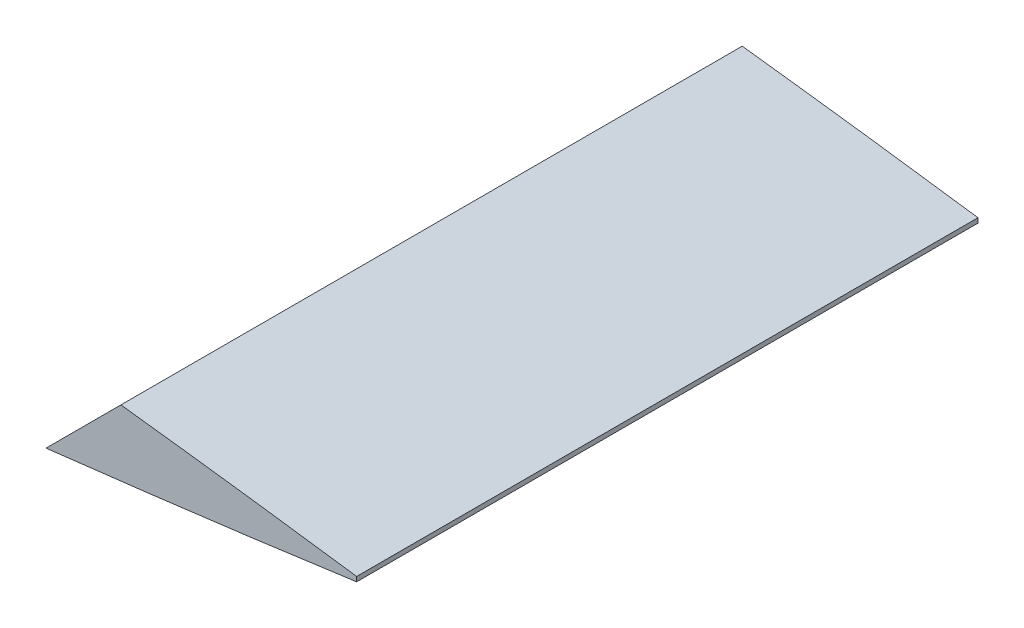
ISO-10303-21;
HEADER;
FILE_DESCRIPTION(('STEP AP214'),'2;1');
FILE_NAME('part.step','',(''),(''),'','','');
FILE_SCHEMA(('AUTOMOTIVE_DESIGN { 1 0 10303 214 1 1 1 1 }'));
ENDSEC;
DATA;
#1=APPLICATION_CONTEXT('core data for automotive mechanical design processes');
#2=APPLICATION_PROTOCOL_DEFINITION('international standard','automotive_design',2000,#1);
#3=PRODUCT_CONTEXT('',#1,'mechanical');
#4=PRODUCT('Part','Part','',(#3));
#5=PRODUCT_RELATED_PRODUCT_CATEGORY('part','',(#4));
#6=PRODUCT_DEFINITION_FORMATION('','',#4);
#7=PRODUCT_DEFINITION_CONTEXT('part definition',#1,'design');
#8=PRODUCT_DEFINITION('design','',#6,#7);
#9=PRODUCT_DEFINITION_SHAPE('','',#8);
#10=(LENGTH_UNIT() NAMED_UNIT(*) SI_UNIT(.MILLI.,.METRE.));
#11=(NAMED_UNIT(*) PLANE_ANGLE_UNIT() SI_UNIT($,.RADIAN.));
#12=(NAMED_UNIT(*) SI_UNIT($,.STERADIAN.) SOLID_ANGLE_UNIT());
#13=UNCERTAINTY_MEASURE_WITH_UNIT(LENGTH_MEASURE(1.E-05),#10,'distance_accuracy_value','');
#14=(GEOMETRIC_REPRESENTATION_CONTEXT(3) GLOBAL_UNCERTAINTY_ASSIGNED_CONTEXT((#13)) GLOBAL_UNIT_ASSIGNED_CONTEXT((#10,
#11,#12)) REPRESENTATION_CONTEXT('',''));
#15=CARTESIAN_POINT('',(0.,0.,0.));
#16=DIRECTION('',(0.,0.,1.));
#17=DIRECTION('',(1.,0.,0.));
#18=AXIS2_PLACEMENT_3D('',#15,#16,#17);
#19=CARTESIAN_POINT('',(300.,0.378,100.));
#20=CARTESIAN_POINT('',(299.270406423723,0.479445821702321,100.));
#21=CARTESIAN_POINT('',(297.234667094079,0.762503753929655,100.));
#22=CARTESIAN_POINT('',(293.659650160598,1.25767350567564,100.));
#23=CARTESIAN_POINT('',(289.112411794917,1.87424244263317,100.));
#24=CARTESIAN_POINT('',(284.080816659039,2.54451744035542,100.));
#25=CARTESIAN_POINT('',(278.752044218457,3.23812231587756,100.));
#26=CARTESIAN_POINT('',(273.265899022492,3.93494643569603,100.));
#27=CARTESIAN_POINT('',(267.705955472008,4.62901994283452,100.));
#28=CARTESIAN_POINT('',(262.114563019878,5.31306910693868,100.));
#29=CARTESIAN_POINT('',(256.508348909458,5.98219181245687,100.));
#30=CARTESIAN_POINT('',(250.891738994323,6.63799080906206,100.));
#31=CARTESIAN_POINT('',(245.269556965141,7.28177923500822,100.));
#32=CARTESIAN_POINT('',(239.647345348642,7.91223276352409,100.));
#33=CARTESIAN_POINT('',(234.025130106878,8.52699204615673,100.));
#34=CARTESIAN_POINT('',(228.399087902931,9.12622976388424,100.));
#35=CARTESIAN_POINT('',(222.76825764507,9.71307760610579,100.));
#36=CARTESIAN_POINT('',(217.135920793231,10.2874598097057,100.));
#37=CARTESIAN_POINT('',(211.505410154051,10.8469410839575,100.));
#38=CARTESIAN_POINT('',(205.877619803237,11.3916428267252,100.));
#39=CARTESIAN_POINT('',(200.251512373849,11.9208846239163,100.));
#40=CARTESIAN_POINT('',(194.626420536409,12.4346170780367,100.));
#41=CARTESIAN_POINT('',(189.002797137157,12.9319118094686,100.));
#42=CARTESIAN_POINT('',(183.381530937822,13.4130975813696,100.));
#43=CARTESIAN_POINT('',(177.763225616091,13.8763767009773,100.));
#44=CARTESIAN_POINT('',(172.148301533052,14.3212371935345,100.));
#45=CARTESIAN_POINT('',(166.537529461529,14.7478209184035,100.));
#46=CARTESIAN_POINT('',(160.931736194082,15.1542281440202,100.));
#47=CARTESIAN_POINT('',(155.331708850266,15.5391008558727,100.));
#48=CARTESIAN_POINT('',(149.737538344952,15.9026495636587,100.));
#49=CARTESIAN_POINT('',(144.148688279318,16.241846118568,100.));
#50=CARTESIAN_POINT('',(138.565679604284,16.5574205464223,100.));
#51=CARTESIAN_POINT('',(132.990859803018,16.8473975552547,100.));
#52=CARTESIAN_POINT('',(127.427439440236,17.1102116785312,100.));
#53=CARTESIAN_POINT('',(121.877619637439,17.3438917175145,100.));
#54=CARTESIAN_POINT('',(116.340758577333,17.5452568128182,100.));
#55=CARTESIAN_POINT('',(110.815476382379,17.712679119923,100.));
#56=CARTESIAN_POINT('',(105.301273398415,17.8444979379819,100.));
#57=CARTESIAN_POINT('',(99.8005701155126,17.9400918128776,100.));
#58=CARTESIAN_POINT('',(94.3174358437247,17.9965904385618,100.));
#59=CARTESIAN_POINT('',(88.8557640671298,18.0101244579531,100.));
#60=CARTESIAN_POINT('',(83.4186479748791,17.9792338403315,100.));
#61=CARTESIAN_POINT('',(78.0084808270908,17.8991607130085,100.));
#62=CARTESIAN_POINT('',(72.6284553647751,17.7670337872511,100.));
#63=CARTESIAN_POINT('',(67.2827387457577,17.5794139337101,100.));
#64=CARTESIAN_POINT('',(61.9773648945375,17.331515488689,100.));
#65=CARTESIAN_POINT('',(56.7206910156783,17.0210326511062,100.));
#66=CARTESIAN_POINT('',(51.5251753215055,16.6409580698619,100.));
#67=CARTESIAN_POINT('',(46.4082026187076,16.1901885907441,100.));
#68=CARTESIAN_POINT('',(41.3941760651905,15.6616690993154,100.));
#69=CARTESIAN_POINT('',(36.5156710865437,15.0539637839737,100.));
#70=CARTESIAN_POINT('',(31.8190094409283,14.3656236049764,100.));
#71=CARTESIAN_POINT('',(27.3661648285309,13.6034756838757,100.));
#72=CARTESIAN_POINT('',(23.2352179540624,12.7825834438859,100.));
#73=CARTESIAN_POINT('',(19.5026424507863,11.9202507512816,100.));
#74=CARTESIAN_POINT('',(16.2182713927649,11.0445977962822,100.));
#75=CARTESIAN_POINT('',(13.3891860155784,10.1750762553965,100.));
#76=CARTESIAN_POINT('',(10.9849293334544,9.33349871540906,100.));
#77=CARTESIAN_POINT('',(8.96156147750924,8.52206288153796,100.));
#78=CARTESIAN_POINT('',(7.26729205281864,7.74697600174495,100.));
#79=CARTESIAN_POINT('',(5.84605246563954,7.01062562176008,100.));
#80=CARTESIAN_POINT('',(4.64771108498271,6.30063403293287,100.));
#81=CARTESIAN_POINT('',(3.62823525123192,5.60651366797511,100.));
#82=CARTESIAN_POINT('',(2.75190919699738,4.92663525162572,100.));
#83=CARTESIAN_POINT('',(2.0062573601689,4.24991725904032,100.));
#84=CARTESIAN_POINT('',(1.39058613668709,3.570259491991,100.));
#85=CARTESIAN_POINT('',(0.901000434809516,2.89094225228363,100.));
#86=CARTESIAN_POINT('',(0.529275534924718,2.22021927340558,100.));
#87=CARTESIAN_POINT('',(0.260479536936117,1.56645893590234,100.));
#88=CARTESIAN_POINT('',(0.0857126538537306,0.931035928118987,100.));
#89=CARTESIAN_POINT('',(-0.00350924718492415,0.308981014512189,100.));
#90=CARTESIAN_POINT('',(-0.00350924718492199,-0.308981014512209,100.));
#91=CARTESIAN_POINT('',(0.0857126538537279,-0.931035928118965,100.));
#92=CARTESIAN_POINT('',(0.260479536936107,-1.56645893590232,100.));
#93=CARTESIAN_POINT('',(0.529275534924743,-2.2202192734056,100.));
#94=CARTESIAN_POINT('',(0.901000434809474,-2.89094225228368,100.));
#95=CARTESIAN_POINT('',(1.39058613668717,-3.57025949199063,100.));
#96=CARTESIAN_POINT('',(2.00625736016862,-4.24991725904197,100.));
#97=CARTESIAN_POINT('',(2.75190919699857,-4.92663525161857,100.));
#98=CARTESIAN_POINT('',(3.62823525122678,-5.60651366800603,100.));
#99=CARTESIAN_POINT('',(4.6477110850053,-6.3006340327972,100.));
#100=CARTESIAN_POINT('',(5.84605246553727,-7.01062562237321,100.));
#101=CARTESIAN_POINT('',(7.26729205329404,-7.74697599889616,100.));
#102=CARTESIAN_POINT('',(8.96156147525896,-8.5220628950217,100.));
#103=CARTESIAN_POINT('',(10.9849293441544,-9.33349865129378,100.));
#104=CARTESIAN_POINT('',(13.3891859649807,-10.1750765585832,100.));
#105=CARTESIAN_POINT('',(16.218271629693,-11.0445963765829,100.));
#106=CARTESIAN_POINT('',(19.5026413612413,-11.9202572799561,100.));
#107=CARTESIAN_POINT('',(23.2352227989104,-12.78255441302,100.));
#108=CARTESIAN_POINT('',(27.3661275586072,-13.6035961608478,100.));
#109=CARTESIAN_POINT('',(31.8190750083372,-14.3651133634918,100.));
#110=CARTESIAN_POINT('',(36.5156346373272,-15.0541060972868,100.));
#111=CARTESIAN_POINT('',(41.3941822041013,-15.6616288870965,100.));
#112=CARTESIAN_POINT('',(46.4082009236496,-16.1901996940233,100.));
#113=CARTESIAN_POINT('',(51.5251757859908,-16.6409550273053,100.));
#114=CARTESIAN_POINT('',(56.7206908890808,-17.0210334803687,100.));
#115=CARTESIAN_POINT('',(61.9773649289189,-17.3315152634777,100.));
#116=CARTESIAN_POINT('',(67.2827387364428,-17.5794139947263,100.));
#117=CARTESIAN_POINT('',(72.6284553672946,-17.767033770747,100.));
#118=CARTESIAN_POINT('',(78.0084808264101,-17.8991607174675,100.));
#119=CARTESIAN_POINT('',(83.4186479750628,-17.9792338391277,100.));
#120=CARTESIAN_POINT('',(88.8557640670803,-18.0101244582778,100.));
#121=CARTESIAN_POINT('',(94.317435843738,-17.9965904384742,100.));
#122=CARTESIAN_POINT('',(99.8005701155091,-17.9400918129012,100.));
#123=CARTESIAN_POINT('',(105.301273398416,-17.8444979379756,100.));
#124=CARTESIAN_POINT('',(110.815476382379,-17.7126791199247,100.));
#125=CARTESIAN_POINT('',(116.340758577333,-17.5452568128177,100.));
#126=CARTESIAN_POINT('',(121.877619637439,-17.3438917175146,100.));
#127=CARTESIAN_POINT('',(127.427439440236,-17.1102116785312,100.));
#128=CARTESIAN_POINT('',(132.990859803018,-16.8473975552547,100.));
#129=CARTESIAN_POINT('',(138.565679604284,-16.5574205464223,100.));
#130=CARTESIAN_POINT('',(144.148688279318,-16.241846118568,100.));
#131=CARTESIAN_POINT('',(149.737538344952,-15.9026495636587,100.));
#132=CARTESIAN_POINT('',(155.331708850266,-15.5391008558727,100.));
#133=CARTESIAN_POINT('',(160.931736194082,-15.1542281440202,100.));
#134=CARTESIAN_POINT('',(166.537529461529,-14.7478209184035,100.));
#135=CARTESIAN_POINT('',(172.148301533052,-14.3212371935345,100.));
#136=CARTESIAN_POINT('',(177.763225616091,-13.8763767009773,100.));
#137=CARTESIAN_POINT('',(183.381530937822,-13.4130975813696,100.));
#138=CARTESIAN_POINT('',(189.002797137156,-12.9319118094686,100.));
#139=CARTESIAN_POINT('',(194.626420536409,-12.4346170780367,100.));
#140=CARTESIAN_POINT('',(200.251512373849,-11.9208846239163,100.));
#141=CARTESIAN_POINT('',(205.877619803237,-11.3916428267251,100.));
#142=CARTESIAN_POINT('',(211.505410154051,-10.8469410839575,100.));
#143=CARTESIAN_POINT('',(217.135920793231,-10.2874598097057,100.));
#144=CARTESIAN_POINT('',(222.76825764507,-9.71307760610578,100.));
#145=CARTESIAN_POINT('',(228.399087902931,-9.12622976388424,100.));
#146=CARTESIAN_POINT('',(234.025130106878,-8.52699204615673,100.));
#147=CARTESIAN_POINT('',(239.647345348642,-7.91223276352409,100.));
#148=CARTESIAN_POINT('',(245.269556965141,-7.28177923500822,100.));
#149=CARTESIAN_POINT('',(250.891738994323,-6.63799080906206,100.));
#150=CARTESIAN_POINT('',(256.508348909458,-5.98219181245686,100.));
#151=CARTESIAN_POINT('',(262.114563019878,-5.31306910693868,100.));
#152=CARTESIAN_POINT('',(267.705955472008,-4.62901994283452,100.));
#153=CARTESIAN_POINT('',(273.265899022492,-3.93494643569603,100.));
#154=CARTESIAN_POINT('',(278.752044218457,-3.23812231587756,100.));
#155=CARTESIAN_POINT('',(284.080816659039,-2.54451744035542,100.));
#156=CARTESIAN_POINT('',(289.112411794917,-1.87424244263317,100.));
#157=CARTESIAN_POINT('',(293.659650160598,-1.25767350567564,100.));
#158=CARTESIAN_POINT('',(297.234667094079,-0.76250375392966,100.));
#159=CARTESIAN_POINT('',(299.270406423723,-0.479445821702321,100.));
#160=CARTESIAN_POINT('',(300.,-0.378,100.));
#161=B_SPLINE_CURVE_WITH_KNOTS('',3,(#19,#20,#21,#22,#23,#24,#25,#26,#27,#28,#29,#30,#31,#32,
#33,#34,#35,#36,#37,#38,#39,#40,#41,#42,#43,#44,#45,#46,#47,#48,#49,#50,#51,#52,#53,#54,#55,#56,
#57,#58,#59,#60,#61,#62,#63,#64,#65,#66,#67,#68,#69,#70,#71,#72,#73,#74,#75,#76,#77,#78,#79,#80,
#81,#82,#83,#84,#85,#86,#87,#88,#89,#90,#91,#92,#93,#94,#95,#96,#97,#98,#99,#100,#101,#102,#103,
#104,#105,#106,#107,#108,#109,#110,#111,#112,#113,#114,#115,#116,#117,#118,#119,#120,#121,#122,
#123,#124,#125,#126,#127,#128,#129,#130,#131,#132,#133,#134,#135,#136,#137,#138,#139,#140,#141,
#142,#143,#144,#145,#146,#147,#148,#149,#150,#151,#152,#153,#154,#155,#156,#157,#158,#159,#160),
.UNSPECIFIED.,.F.,.F.,(4,1,1,1,1,1,1,1,1,1,1,1,1,1,1,1,1,1,1,1,1,1,1,1,1,1,1,1,1,1,1,1,1,1,1,1,
1,1,1,1,1,1,1,1,1,1,1,1,1,1,1,1,1,1,1,1,1,1,1,1,1,1,1,1,1,1,1,1,1,1,1,1,1,1,1,1,1,1,1,1,1,1,1,1,
1,1,1,1,1,1,1,1,1,1,1,1,1,1,1,1,1,1,1,1,1,1,1,1,1,1,1,1,1,1,1,1,1,1,1,1,1,1,1,1,1,1,1,1,1,1,1,1,
1,1,1,1,1,1,1,4),(0.,0.00361222059404388,0.0100789532278554,0.0176986181570895,
0.0261151107220122,0.0349709660638799,0.0440503796486832,0.0532343297369713,0.0624475697827881,
0.0716739929600303,0.0809213185094618,0.0901775382979332,0.0994243421366575,0.108664440992277,
0.117912199004999,0.127169502180609,0.136426594565023,0.145675425736823,0.154916495397513,
0.164153236916375,0.173386648526191,0.182615736180586,0.191838089492061,0.201053134496137,
0.210260392550908,0.219458942389608,0.228646746886173,0.237822316287067,0.24698522413025,
0.25613738364592,0.265279415916296,0.274406949966901,0.283512193452554,0.292591781113348,
0.30164628535433,0.310681792653752,0.31969906757785,0.32869451957993,0.337660159695399,
0.346588583205171,0.355477411634764,0.364322937295264,0.373121613643215,0.381867635356829,
0.390553004884712,0.399166025869356,0.407689628257838,0.416098119030288,0.424354887451602,
0.432412428746428,0.440204728485537,0.447630505181733,0.454563637698397,0.460855379429517,
0.466413319364109,0.471228610451128,0.475365774282038,0.478901259753558,0.481915077255184,
0.484498871900912,0.486747127386087,0.488741251833575,0.490543179252672,0.492182103901344,
0.493672830547239,0.495031907807012,0.496279059618418,0.497424736506128,0.498490165528455,
0.499502757789975,0.500497253863142,0.501509846124661,0.502575275146988,0.503720952034698,
0.504968103846104,0.506327181105877,0.507817907751772,0.509456832400444,0.511258759819541,
0.51325288426703,0.515501139752205,0.518084934397933,0.521098751899559,0.524634237371078,
0.528771401201989,0.533586692289008,0.539144632223599,0.545436373954719,0.552369506471383,
0.559795200118754,0.567587571253572,0.575645112548398,0.583901880969712,0.592310371742162,
0.600833974130644,0.609446995115288,0.618132364643171,0.626878386356785,0.635677062704736,
0.644522588365236,0.653411416794829,0.662339840304601,0.67130548042007,0.68030093242215,
0.689318207346248,0.69835371464567,0.707408218886652,0.716487806547446,0.725593050033099,
0.734720584083704,0.74386261635408,0.75301477586975,0.762177683712933,0.771353253113827,
0.780541057610392,0.789739607449093,0.798946865503863,0.808161910507939,0.817384263819414,
0.826613351473809,0.835846763083625,0.845083504602487,0.854324574263177,0.863573405434977,
0.872830497819391,0.882087800995001,0.891335559007723,0.900575657863343,0.909822461702067,
0.919078681490538,0.92832600703997,0.937552430217212,0.946765670263029,0.955949620351317,
0.96502903393612,0.973884889277988,0.982301381842911,0.989921046772145,0.996387779405956,1.),.UNSPECIFIED.);
#162=DIRECTION('',(0.,0.,-1.));
#163=VECTOR('',#162,1.);
#164=SURFACE_OF_LINEAR_EXTRUSION('',#161,#163);
#165=DIRECTION('',(0.,0.,-1.));
#166=VECTOR('',#165,1.);
#167=CARTESIAN_POINT('',(262.056174111751,5.31733759024931,100.));
#168=LINE('',#167,#166);
#169=CARTESIAN_POINT('',(262.056174116122,5.31733759462045,100.));
#170=VERTEX_POINT('',#169);
#171=CARTESIAN_POINT('',(262.056174116122,5.31733759462045,0.));
#172=VERTEX_POINT('',#171);
#173=EDGE_CURVE('E84',#170,#172,#168,.T.);
#174=ORIENTED_EDGE('',*,*,#173,.F.);
#175=CARTESIAN_POINT('',(300.,0.378,100.));
#176=VERTEX_POINT('',#175);
#177=EDGE_CURVE('E89',#176,#170,#161,.T.);
#178=ORIENTED_EDGE('',*,*,#177,.F.);
#179=DIRECTION('',(0.,0.,-1.));
#180=VECTOR('',#179,1.);
#181=CARTESIAN_POINT('',(300.,0.378,100.));
#182=LINE('',#181,#180);
#183=CARTESIAN_POINT('',(300.,0.378,0.));
#184=VERTEX_POINT('',#183);
#185=EDGE_CURVE('E43',#176,#184,#182,.T.);
#186=ORIENTED_EDGE('',*,*,#185,.T.);
#187=CARTESIAN_POINT('',(300.,0.378,0.));
#188=CARTESIAN_POINT('',(299.270406423723,0.479445821702321,0.));
#189=CARTESIAN_POINT('',(297.234667094079,0.762503753929655,0.));
#190=CARTESIAN_POINT('',(293.659650160598,1.25767350567564,0.));
#191=CARTESIAN_POINT('',(289.112411794917,1.87424244263317,0.));
#192=CARTESIAN_POINT('',(284.080816659039,2.54451744035542,0.));
#193=CARTESIAN_POINT('',(278.752044218457,3.23812231587756,0.));
#194=CARTESIAN_POINT('',(273.265899022492,3.93494643569603,0.));
#195=CARTESIAN_POINT('',(267.705955472008,4.62901994283452,0.));
#196=CARTESIAN_POINT('',(262.114563019878,5.31306910693868,0.));
#197=CARTESIAN_POINT('',(256.508348909458,5.98219181245687,0.));
#198=CARTESIAN_POINT('',(250.891738994323,6.63799080906206,0.));
#199=CARTESIAN_POINT('',(245.269556965141,7.28177923500822,0.));
#200=CARTESIAN_POINT('',(239.647345348642,7.91223276352409,0.));
#201=CARTESIAN_POINT('',(234.025130106878,8.52699204615673,0.));
#202=CARTESIAN_POINT('',(228.399087902931,9.12622976388424,0.));
#203=CARTESIAN_POINT('',(222.76825764507,9.71307760610579,0.));
#204=CARTESIAN_POINT('',(217.135920793231,10.2874598097057,0.));
#205=CARTESIAN_POINT('',(211.505410154051,10.8469410839575,0.));
#206=CARTESIAN_POINT('',(205.877619803237,11.3916428267252,0.));
#207=CARTESIAN_POINT('',(200.251512373849,11.9208846239163,0.));
#208=CARTESIAN_POINT('',(194.626420536409,12.4346170780367,0.));
#209=CARTESIAN_POINT('',(189.002797137157,12.9319118094686,0.));
#210=CARTESIAN_POINT('',(183.381530937822,13.4130975813696,0.));
#211=CARTESIAN_POINT('',(177.763225616091,13.8763767009773,0.));
#212=CARTESIAN_POINT('',(172.148301533052,14.3212371935345,0.));
#213=CARTESIAN_POINT('',(166.537529461529,14.7478209184035,0.));
#214=CARTESIAN_POINT('',(160.931736194082,15.1542281440202,0.));
#215=CARTESIAN_POINT('',(155.331708850266,15.5391008558727,0.));
#216=CARTESIAN_POINT('',(149.737538344952,15.9026495636587,0.));
#217=CARTESIAN_POINT('',(144.148688279318,16.241846118568,0.));
#218=CARTESIAN_POINT('',(138.565679604284,16.5574205464223,0.));
#219=CARTESIAN_POINT('',(132.990859803018,16.8473975552547,0.));
#220=CARTESIAN_POINT('',(127.427439440236,17.1102116785312,0.));
#221=CARTESIAN_POINT('',(121.877619637439,17.3438917175145,0.));
#222=CARTESIAN_POINT('',(116.340758577333,17.5452568128182,0.));
#223=CARTESIAN_POINT('',(110.815476382379,17.712679119923,0.));
#224=CARTESIAN_POINT('',(105.301273398415,17.8444979379819,0.));
#225=CARTESIAN_POINT('',(99.8005701155126,17.9400918128776,0.));
#226=CARTESIAN_POINT('',(94.3174358437247,17.9965904385618,0.));
#227=CARTESIAN_POINT('',(88.8557640671298,18.0101244579531,0.));
#228=CARTESIAN_POINT('',(83.4186479748791,17.9792338403315,0.));
#229=CARTESIAN_POINT('',(78.0084808270908,17.8991607130085,0.));
#230=CARTESIAN_POINT('',(72.6284553647751,17.7670337872511,0.));
#231=CARTESIAN_POINT('',(67.2827387457577,17.5794139337101,0.));
#232=CARTESIAN_POINT('',(61.9773648945375,17.331515488689,0.));
#233=CARTESIAN_POINT('',(56.7206910156783,17.0210326511062,0.));
#234=CARTESIAN_POINT('',(51.5251753215055,16.6409580698619,0.));
#235=CARTESIAN_POINT('',(46.4082026187076,16.1901885907441,0.));
#236=CARTESIAN_POINT('',(41.3941760651905,15.6616690993154,0.));
#237=CARTESIAN_POINT('',(36.5156710865437,15.0539637839737,0.));
#238=CARTESIAN_POINT('',(31.8190094409283,14.3656236049764,0.));
#239=CARTESIAN_POINT('',(27.3661648285309,13.6034756838757,0.));
#240=CARTESIAN_POINT('',(23.2352179540624,12.7825834438859,0.));
#241=CARTESIAN_POINT('',(19.5026424507863,11.9202507512816,0.));
#242=CARTESIAN_POINT('',(16.2182713927649,11.0445977962822,0.));
#243=CARTESIAN_POINT('',(13.3891860155784,10.1750762553965,0.));
#244=CARTESIAN_POINT('',(10.9849293334544,9.33349871540906,0.));
#245=CARTESIAN_POINT('',(8.96156147750924,8.52206288153796,0.));
#246=CARTESIAN_POINT('',(7.26729205281864,7.74697600174495,0.));
#247=CARTESIAN_POINT('',(5.84605246563954,7.01062562176008,0.));
#248=CARTESIAN_POINT('',(4.64771108498271,6.30063403293287,0.));
#249=CARTESIAN_POINT('',(3.62823525123192,5.60651366797511,0.));
#250=CARTESIAN_POINT('',(2.75190919699738,4.92663525162572,0.));
#251=CARTESIAN_POINT('',(2.0062573601689,4.24991725904032,0.));
#252=CARTESIAN_POINT('',(1.39058613668709,3.570259491991,0.));
#253=CARTESIAN_POINT('',(0.901000434809516,2.89094225228363,0.));
#254=CARTESIAN_POINT('',(0.529275534924718,2.22021927340558,0.));
#255=CARTESIAN_POINT('',(0.260479536936117,1.56645893590234,0.));
#256=CARTESIAN_POINT('',(0.0857126538537306,0.931035928118987,0.));
#257=CARTESIAN_POINT('',(-0.00350924718492415,0.308981014512189,0.));
#258=CARTESIAN_POINT('',(-0.00350924718492199,-0.308981014512209,0.));
#259=CARTESIAN_POINT('',(0.0857126538537279,-0.931035928118965,0.));
#260=CARTESIAN_POINT('',(0.260479536936107,-1.56645893590232,0.));
#261=CARTESIAN_POINT('',(0.529275534924743,-2.2202192734056,0.));
#262=CARTESIAN_POINT('',(0.901000434809474,-2.89094225228368,0.));
#263=CARTESIAN_POINT('',(1.39058613668717,-3.57025949199063,0.));
#264=CARTESIAN_POINT('',(2.00625736016862,-4.24991725904197,0.));
#265=CARTESIAN_POINT('',(2.75190919699857,-4.92663525161857,0.));
#266=CARTESIAN_POINT('',(3.62823525122678,-5.60651366800603,0.));
#267=CARTESIAN_POINT('',(4.6477110850053,-6.3006340327972,0.));
#268=CARTESIAN_POINT('',(5.84605246553727,-7.01062562237321,0.));
#269=CARTESIAN_POINT('',(7.26729205329404,-7.74697599889616,0.));
#270=CARTESIAN_POINT('',(8.96156147525896,-8.5220628950217,0.));
#271=CARTESIAN_POINT('',(10.9849293441544,-9.33349865129378,0.));
#272=CARTESIAN_POINT('',(13.3891859649807,-10.1750765585832,0.));
#273=CARTESIAN_POINT('',(16.218271629693,-11.0445963765829,0.));
#274=CARTESIAN_POINT('',(19.5026413612413,-11.9202572799561,0.));
#275=CARTESIAN_POINT('',(23.2352227989104,-12.78255441302,0.));
#276=CARTESIAN_POINT('',(27.3661275586072,-13.6035961608478,0.));
#277=CARTESIAN_POINT('',(31.8190750083372,-14.3651133634918,0.));
#278=CARTESIAN_POINT('',(36.5156346373272,-15.0541060972868,0.));
#279=CARTESIAN_POINT('',(41.3941822041013,-15.6616288870965,0.));
#280=CARTESIAN_POINT('',(46.4082009236496,-16.1901996940233,0.));
#281=CARTESIAN_POINT('',(51.5251757859908,-16.6409550273053,0.));
#282=CARTESIAN_POINT('',(56.7206908890808,-17.0210334803687,0.));
#283=CARTESIAN_POINT('',(61.9773649289189,-17.3315152634777,0.));
#284=CARTESIAN_POINT('',(67.2827387364428,-17.5794139947263,0.));
#285=CARTESIAN_POINT('',(72.6284553672946,-17.767033770747,0.));
#286=CARTESIAN_POINT('',(78.0084808264101,-17.8991607174675,0.));
#287=CARTESIAN_POINT('',(83.4186479750628,-17.9792338391277,0.));
#288=CARTESIAN_POINT('',(88.8557640670803,-18.0101244582778,0.));
#289=CARTESIAN_POINT('',(94.317435843738,-17.9965904384742,0.));
#290=CARTESIAN_POINT('',(99.8005701155091,-17.9400918129012,0.));
#291=CARTESIAN_POINT('',(105.301273398416,-17.8444979379756,0.));
#292=CARTESIAN_POINT('',(110.815476382379,-17.7126791199247,0.));
#293=CARTESIAN_POINT('',(116.340758577333,-17.5452568128177,0.));
#294=CARTESIAN_POINT('',(121.877619637439,-17.3438917175146,0.));
#295=CARTESIAN_POINT('',(127.427439440236,-17.1102116785312,0.));
#296=CARTESIAN_POINT('',(132.990859803018,-16.8473975552547,0.));
#297=CARTESIAN_POINT('',(138.565679604284,-16.5574205464223,0.));
#298=CARTESIAN_POINT('',(144.148688279318,-16.241846118568,0.));
#299=CARTESIAN_POINT('',(149.737538344952,-15.9026495636587,0.));
#300=CARTESIAN_POINT('',(155.331708850266,-15.5391008558727,0.));
#301=CARTESIAN_POINT('',(160.931736194082,-15.1542281440202,0.));
#302=CARTESIAN_POINT('',(166.537529461529,-14.7478209184035,0.));
#303=CARTESIAN_POINT('',(172.148301533052,-14.3212371935345,0.));
#304=CARTESIAN_POINT('',(177.763225616091,-13.8763767009773,0.));
#305=CARTESIAN_POINT('',(183.381530937822,-13.4130975813696,0.));
#306=CARTESIAN_POINT('',(189.002797137156,-12.9319118094686,0.));
#307=CARTESIAN_POINT('',(194.626420536409,-12.4346170780367,0.));
#308=CARTESIAN_POINT('',(200.251512373849,-11.9208846239163,0.));
#309=CARTESIAN_POINT('',(205.877619803237,-11.3916428267251,0.));
#310=CARTESIAN_POINT('',(211.505410154051,-10.8469410839575,0.));
#311=CARTESIAN_POINT('',(217.135920793231,-10.2874598097057,0.));
#312=CARTESIAN_POINT('',(222.76825764507,-9.71307760610578,0.));
#313=CARTESIAN_POINT('',(228.399087902931,-9.12622976388424,0.));
#314=CARTESIAN_POINT('',(234.025130106878,-8.52699204615673,0.));
#315=CARTESIAN_POINT('',(239.647345348642,-7.91223276352409,0.));
#316=CARTESIAN_POINT('',(245.269556965141,-7.28177923500822,0.));
#317=CARTESIAN_POINT('',(250.891738994323,-6.63799080906206,0.));
#318=CARTESIAN_POINT('',(256.508348909458,-5.98219181245686,0.));
#319=CARTESIAN_POINT('',(262.114563019878,-5.31306910693868,0.));
#320=CARTESIAN_POINT('',(267.705955472008,-4.62901994283452,0.));
#321=CARTESIAN_POINT('',(273.265899022492,-3.93494643569603,0.));
#322=CARTESIAN_POINT('',(278.752044218457,-3.23812231587756,0.));
#323=CARTESIAN_POINT('',(284.080816659039,-2.54451744035542,0.));
#324=CARTESIAN_POINT('',(289.112411794917,-1.87424244263317,0.));
#325=CARTESIAN_POINT('',(293.659650160598,-1.25767350567564,0.));
#326=CARTESIAN_POINT('',(297.234667094079,-0.76250375392966,0.));
#327=CARTESIAN_POINT('',(299.270406423723,-0.479445821702321,0.));
#328=CARTESIAN_POINT('',(300.,-0.378,0.));
#329=B_SPLINE_CURVE_WITH_KNOTS('',3,(#187,#188,#189,#190,#191,#192,#193,#194,#195,#196,#197,
#198,#199,#200,#201,#202,#203,#204,#205,#206,#207,#208,#209,#210,#211,#212,#213,#214,#215,#216,
#217,#218,#219,#220,#221,#222,#223,#224,#225,#226,#227,#228,#229,#230,#231,#232,#233,#234,#235,
#236,#237,#238,#239,#240,#241,#242,#243,#244,#245,#246,#247,#248,#249,#250,#251,#252,#253,#254,
#255,#256,#257,#258,#259,#260,#261,#262,#263,#264,#265,#266,#267,#268,#269,#270,#271,#272,#273,
#274,#275,#276,#277,#278,#279,#280,#281,#282,#283,#284,#285,#286,#287,#288,#289,#290,#291,#292,
#293,#294,#295,#296,#297,#298,#299,#300,#301,#302,#303,#304,#305,#306,#307,#308,#309,#310,#311,
#312,#313,#314,#315,#316,#317,#318,#319,#320,#321,#322,#323,#324,#325,#326,#327,#328),
.UNSPECIFIED.,.F.,.F.,(4,1,1,1,1,1,1,1,1,1,1,1,1,1,1,1,1,1,1,1,1,1,1,1,1,1,1,1,1,1,1,1,1,1,1,1,
1,1,1,1,1,1,1,1,1,1,1,1,1,1,1,1,1,1,1,1,1,1,1,1,1,1,1,1,1,1,1,1,1,1,1,1,1,1,1,1,1,1,1,1,1,1,1,1,
1,1,1,1,1,1,1,1,1,1,1,1,1,1,1,1,1,1,1,1,1,1,1,1,1,1,1,1,1,1,1,1,1,1,1,1,1,1,1,1,1,1,1,1,1,1,1,1,
1,1,1,1,1,1,1,4),(0.,0.00361222059404388,0.0100789532278554,0.0176986181570895,
0.0261151107220122,0.0349709660638799,0.0440503796486832,0.0532343297369713,0.0624475697827881,
0.0716739929600303,0.0809213185094618,0.0901775382979332,0.0994243421366575,0.108664440992277,
0.117912199004999,0.127169502180609,0.136426594565023,0.145675425736823,0.154916495397513,
0.164153236916375,0.173386648526191,0.182615736180586,0.191838089492061,0.201053134496137,
0.210260392550908,0.219458942389608,0.228646746886173,0.237822316287067,0.24698522413025,
0.25613738364592,0.265279415916296,0.274406949966901,0.283512193452554,0.292591781113348,
0.30164628535433,0.310681792653752,0.31969906757785,0.32869451957993,0.337660159695399,
0.346588583205171,0.355477411634764,0.364322937295264,0.373121613643215,0.381867635356829,
0.390553004884712,0.399166025869356,0.407689628257838,0.416098119030288,0.424354887451602,
0.432412428746428,0.440204728485537,0.447630505181733,0.454563637698397,0.460855379429517,
0.466413319364109,0.471228610451128,0.475365774282038,0.478901259753558,0.481915077255184,
0.484498871900912,0.486747127386087,0.488741251833575,0.490543179252672,0.492182103901344,
0.493672830547239,0.495031907807012,0.496279059618418,0.497424736506128,0.498490165528455,
0.499502757789975,0.500497253863142,0.501509846124661,0.502575275146988,0.503720952034698,
0.504968103846104,0.506327181105877,0.507817907751772,0.509456832400444,0.511258759819541,
0.51325288426703,0.515501139752205,0.518084934397933,0.521098751899559,0.524634237371078,
0.528771401201989,0.533586692289008,0.539144632223599,0.545436373954719,0.552369506471383,
0.559795200118754,0.567587571253572,0.575645112548398,0.583901880969712,0.592310371742162,
0.600833974130644,0.609446995115288,0.618132364643171,0.626878386356785,0.635677062704736,
0.644522588365236,0.653411416794829,0.662339840304601,0.67130548042007,0.68030093242215,
0.689318207346248,0.69835371464567,0.707408218886652,0.716487806547446,0.725593050033099,
0.734720584083704,0.74386261635408,0.75301477586975,0.762177683712933,0.771353253113827,
0.780541057610392,0.789739607449093,0.798946865503863,0.808161910507939,0.817384263819414,
0.826613351473809,0.835846763083625,0.845083504602487,0.854324574263177,0.863573405434977,
0.872830497819391,0.882087800995001,0.891335559007723,0.900575657863343,0.909822461702067,
0.919078681490538,0.92832600703997,0.937552430217212,0.946765670263029,0.955949620351317,
0.96502903393612,0.973884889277988,0.982301381842911,0.989921046772145,0.996387779405956,1.),.UNSPECIFIED.);
#330=EDGE_CURVE('E93',#184,#172,#329,.T.);
#331=ORIENTED_EDGE('',*,*,#330,.T.);
#332=EDGE_LOOP('',(#174,#178,#186,#331));
#333=FACE_BOUND('',#332,.T.);
#334=ADVANCED_FACE('F34',(#333),#164,.F.);
#335=CARTESIAN_POINT('',(6.8064612781216E-05,3.56765379046865E-06,100.));
#336=DIRECTION('',(0.,0.,-1.));
#337=DIRECTION('',(-1.,0.,0.));
#338=AXIS2_PLACEMENT_3D('',#335,#336,#337);
#339=PLANE('',#338);
#340=DIRECTION('',(0.707106781186543,0.707106781186552,0.));
#341=VECTOR('',#340,1.);
#342=CARTESIAN_POINT('',(250.,-6.73883652150179,100.));
#343=LINE('',#342,#341);
#344=CARTESIAN_POINT('',(250.,-6.73883652150179,100.));
#345=VERTEX_POINT('',#344);
#346=EDGE_CURVE('E81',#345,#170,#343,.T.);
#347=ORIENTED_EDGE('',*,*,#346,.F.);
#348=CARTESIAN_POINT('',(300.,-0.378,100.));
#349=VERTEX_POINT('',#348);
#350=EDGE_CURVE('E87',#345,#349,#161,.T.);
#351=ORIENTED_EDGE('',*,*,#350,.T.);
#352=DIRECTION('',(0.,1.,0.));
#353=VECTOR('',#352,1.);
#354=CARTESIAN_POINT('',(300.,0.378,100.));
#355=LINE('',#354,#353);
#356=EDGE_CURVE('E51',#349,#176,#355,.T.);
#357=ORIENTED_EDGE('',*,*,#356,.T.);
#358=ORIENTED_EDGE('',*,*,#177,.T.);
#359=EDGE_LOOP('',(#347,#351,#357,#358));
#360=FACE_BOUND('',#359,.T.);
#361=ADVANCED_FACE('F86',(#360),#339,.F.);
#362=CARTESIAN_POINT('',(6.8064612781216E-05,3.56765379046865E-06,0.));
#363=DIRECTION('',(0.,0.,-1.));
#364=DIRECTION('',(-1.,0.,0.));
#365=AXIS2_PLACEMENT_3D('',#362,#363,#364);
#366=PLANE('',#365);
#367=CARTESIAN_POINT('',(250.,-6.73883652150179,0.));
#368=VERTEX_POINT('',#367);
#369=CARTESIAN_POINT('',(300.,-0.378,0.));
#370=VERTEX_POINT('',#369);
#371=EDGE_CURVE('E62',#368,#370,#329,.T.);
#372=ORIENTED_EDGE('',*,*,#371,.F.);
#373=DIRECTION('',(0.707106781186543,0.707106781186552,0.));
#374=VECTOR('',#373,1.);
#375=CARTESIAN_POINT('',(250.,-6.73883652150179,0.));
#376=LINE('',#375,#374);
#377=EDGE_CURVE('E71',#368,#172,#376,.T.);
#378=ORIENTED_EDGE('',*,*,#377,.T.);
#379=ORIENTED_EDGE('',*,*,#330,.F.);
#380=DIRECTION('',(0.,1.,0.));
#381=VECTOR('',#380,1.);
#382=CARTESIAN_POINT('',(300.,0.378,0.));
#383=LINE('',#382,#381);
#384=EDGE_CURVE('E92',#370,#184,#383,.T.);
#385=ORIENTED_EDGE('',*,*,#384,.F.);
#386=EDGE_LOOP('',(#372,#378,#379,#385));
#387=FACE_BOUND('',#386,.T.);
#388=ADVANCED_FACE('F115',(#387),#366,.T.);
#389=DIRECTION('',(0.,0.,-1.));
#390=VECTOR('',#389,1.);
#391=CARTESIAN_POINT('',(250.,-6.73883651929539,100.));
#392=LINE('',#391,#390);
#393=EDGE_CURVE('E78',#368,#345,#392,.F.);
#394=ORIENTED_EDGE('',*,*,#393,.F.);
#395=ORIENTED_EDGE('',*,*,#371,.T.);
#396=DIRECTION('',(0.,0.,-1.));
#397=VECTOR('',#396,1.);
#398=CARTESIAN_POINT('',(300.,-0.378,100.));
#399=LINE('',#398,#397);
#400=EDGE_CURVE('E12',#349,#370,#399,.T.);
#401=ORIENTED_EDGE('',*,*,#400,.F.);
#402=ORIENTED_EDGE('',*,*,#350,.F.);
#403=EDGE_LOOP('',(#394,#395,#401,#402));
#404=FACE_BOUND('',#403,.T.);
#405=ADVANCED_FACE('F91',(#404),#164,.F.);
#406=CARTESIAN_POINT('',(300.,0.378,100.));
#407=DIRECTION('',(-1.,0.,0.));
#408=DIRECTION('',(0.,0.,1.));
#409=AXIS2_PLACEMENT_3D('',#406,#407,#408);
#410=PLANE('',#409);
#411=ORIENTED_EDGE('',*,*,#384,.T.);
#412=ORIENTED_EDGE('',*,*,#185,.F.);
#413=ORIENTED_EDGE('',*,*,#356,.F.);
#414=ORIENTED_EDGE('',*,*,#400,.T.);
#415=EDGE_LOOP('',(#411,#412,#413,#414));
#416=FACE_BOUND('',#415,.T.);
#417=ADVANCED_FACE('F117',(#416),#410,.F.);
#418=CARTESIAN_POINT('',(250.,-6.73883652150179,100.));
#419=DIRECTION('',(-0.707106781186552,0.707106781186543,0.));
#420=DIRECTION('',(-0.707106781186543,-0.707106781186552,0.));
#421=AXIS2_PLACEMENT_3D('',#418,#419,#420);
#422=PLANE('',#421);
#423=ORIENTED_EDGE('',*,*,#173,.T.);
#424=ORIENTED_EDGE('',*,*,#377,.F.);
#425=ORIENTED_EDGE('',*,*,#393,.T.);
#426=ORIENTED_EDGE('',*,*,#346,.T.);
#427=EDGE_LOOP('',(#423,#424,#425,#426));
#428=FACE_BOUND('',#427,.T.);
#429=ADVANCED_FACE('F80',(#428),#422,.T.);
#430=CLOSED_SHELL('',(#334,#361,#388,#405,#417,#429));
#431=MANIFOLD_SOLID_BREP('B2',#430);
#432=ADVANCED_BREP_SHAPE_REPRESENTATION('',(#18,#431),#14);
#433=SHAPE_DEFINITION_REPRESENTATION(#9,#432);
ENDSEC;
END-ISO-10303-21;
